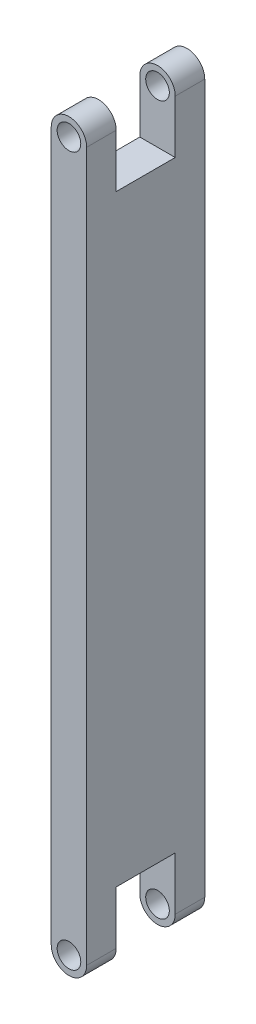
ISO-10303-21;
HEADER;
FILE_DESCRIPTION(('STEP AP214'),'2;1');
FILE_NAME('part.step','',(''),(''),'','','');
FILE_SCHEMA(('AUTOMOTIVE_DESIGN { 1 0 10303 214 1 1 1 1 }'));
ENDSEC;
DATA;
#1=APPLICATION_CONTEXT('core data for automotive mechanical design processes');
#2=APPLICATION_PROTOCOL_DEFINITION('international standard','automotive_design',2000,#1);
#3=PRODUCT_CONTEXT('',#1,'mechanical');
#4=PRODUCT('Part','Part','',(#3));
#5=PRODUCT_RELATED_PRODUCT_CATEGORY('part','',(#4));
#6=PRODUCT_DEFINITION_FORMATION('','',#4);
#7=PRODUCT_DEFINITION_CONTEXT('part definition',#1,'design');
#8=PRODUCT_DEFINITION('design','',#6,#7);
#9=PRODUCT_DEFINITION_SHAPE('','',#8);
#10=(LENGTH_UNIT() NAMED_UNIT(*) SI_UNIT(.MILLI.,.METRE.));
#11=(NAMED_UNIT(*) PLANE_ANGLE_UNIT() SI_UNIT($,.RADIAN.));
#12=(NAMED_UNIT(*) SI_UNIT($,.STERADIAN.) SOLID_ANGLE_UNIT());
#13=UNCERTAINTY_MEASURE_WITH_UNIT(LENGTH_MEASURE(1.E-05),#10,'distance_accuracy_value','');
#14=(GEOMETRIC_REPRESENTATION_CONTEXT(3) GLOBAL_UNCERTAINTY_ASSIGNED_CONTEXT((#13)) GLOBAL_UNIT_ASSIGNED_CONTEXT((#10,
#11,#12)) REPRESENTATION_CONTEXT('',''));
#15=CARTESIAN_POINT('',(0.,0.,0.));
#16=DIRECTION('',(0.,0.,1.));
#17=DIRECTION('',(1.,0.,0.));
#18=AXIS2_PLACEMENT_3D('',#15,#16,#17);
#19=CARTESIAN_POINT('',(0.,0.,50.));
#20=DIRECTION('',(0.,0.,-1.));
#21=DIRECTION('',(-1.,0.,0.));
#22=AXIS2_PLACEMENT_3D('',#19,#20,#21);
#23=CYLINDRICAL_SURFACE('',#22,7.5);
#24=DIRECTION('',(0.,0.,-1.));
#25=VECTOR('',#24,1.);
#26=CARTESIAN_POINT('',(7.5,0.,50.));
#27=LINE('',#26,#25);
#28=CARTESIAN_POINT('',(7.5,0.,12.5));
#29=VERTEX_POINT('',#28);
#30=CARTESIAN_POINT('',(7.5,0.,0.));
#31=VERTEX_POINT('',#30);
#32=EDGE_CURVE('E161',#29,#31,#27,.T.);
#33=ORIENTED_EDGE('',*,*,#32,.F.);
#34=CARTESIAN_POINT('',(0.,0.,12.5));
#35=DIRECTION('',(0.,0.,-1.));
#36=DIRECTION('',(0.,1.,0.));
#37=AXIS2_PLACEMENT_3D('',#34,#35,#36);
#38=CIRCLE('',#37,7.5);
#39=CARTESIAN_POINT('',(-7.5,0.,12.5));
#40=VERTEX_POINT('',#39);
#41=EDGE_CURVE('E199',#29,#40,#38,.T.);
#42=ORIENTED_EDGE('',*,*,#41,.T.);
#43=DIRECTION('',(0.,0.,-1.));
#44=VECTOR('',#43,1.);
#45=CARTESIAN_POINT('',(-7.5,0.,50.));
#46=LINE('',#45,#44);
#47=CARTESIAN_POINT('',(-7.5,0.,0.));
#48=VERTEX_POINT('',#47);
#49=EDGE_CURVE('E232',#40,#48,#46,.T.);
#50=ORIENTED_EDGE('',*,*,#49,.T.);
#51=CARTESIAN_POINT('',(0.,0.,0.));
#52=DIRECTION('',(0.,0.,1.));
#53=DIRECTION('',(1.,0.,0.));
#54=AXIS2_PLACEMENT_3D('',#51,#52,#53);
#55=CIRCLE('',#54,7.5);
#56=EDGE_CURVE('E222',#48,#31,#55,.T.);
#57=ORIENTED_EDGE('',*,*,#56,.T.);
#58=EDGE_LOOP('',(#33,#42,#50,#57));
#59=FACE_BOUND('',#58,.T.);
#60=ADVANCED_FACE('F34',(#59),#23,.T.);
#61=CARTESIAN_POINT('',(0.,300.,50.));
#62=DIRECTION('',(0.,0.,-1.));
#63=DIRECTION('',(-1.,0.,0.));
#64=AXIS2_PLACEMENT_3D('',#61,#62,#63);
#65=CYLINDRICAL_SURFACE('',#64,7.5);
#66=DIRECTION('',(0.,0.,-1.));
#67=VECTOR('',#66,1.);
#68=CARTESIAN_POINT('',(7.5,300.,50.));
#69=LINE('',#68,#67);
#70=CARTESIAN_POINT('',(7.5,300.,50.));
#71=VERTEX_POINT('',#70);
#72=CARTESIAN_POINT('',(7.5,300.,37.5));
#73=VERTEX_POINT('',#72);
#74=EDGE_CURVE('E154',#71,#73,#69,.T.);
#75=ORIENTED_EDGE('',*,*,#74,.T.);
#76=CARTESIAN_POINT('',(0.,300.,37.5));
#77=DIRECTION('',(0.,0.,1.));
#78=DIRECTION('',(1.,0.,0.));
#79=AXIS2_PLACEMENT_3D('',#76,#77,#78);
#80=CIRCLE('',#79,7.5);
#81=CARTESIAN_POINT('',(-7.5,300.,37.5));
#82=VERTEX_POINT('',#81);
#83=EDGE_CURVE('E220',#73,#82,#80,.T.);
#84=ORIENTED_EDGE('',*,*,#83,.T.);
#85=DIRECTION('',(0.,0.,-1.));
#86=VECTOR('',#85,1.);
#87=CARTESIAN_POINT('',(-7.5,300.,50.));
#88=LINE('',#87,#86);
#89=CARTESIAN_POINT('',(-7.5,300.,50.));
#90=VERTEX_POINT('',#89);
#91=EDGE_CURVE('E146',#90,#82,#88,.T.);
#92=ORIENTED_EDGE('',*,*,#91,.F.);
#93=CARTESIAN_POINT('',(0.,300.,50.));
#94=DIRECTION('',(0.,0.,1.));
#95=DIRECTION('',(1.,0.,0.));
#96=AXIS2_PLACEMENT_3D('',#93,#94,#95);
#97=CIRCLE('',#96,7.5);
#98=EDGE_CURVE('E229',#71,#90,#97,.T.);
#99=ORIENTED_EDGE('',*,*,#98,.F.);
#100=EDGE_LOOP('',(#75,#84,#92,#99));
#101=FACE_BOUND('',#100,.T.);
#102=ADVANCED_FACE('F266',(#101),#65,.T.);
#103=CARTESIAN_POINT('',(-7.5,0.,50.));
#104=VERTEX_POINT('',#103);
#105=CARTESIAN_POINT('',(-7.5,0.,37.5));
#106=VERTEX_POINT('',#105);
#107=EDGE_CURVE('E156',#104,#106,#46,.T.);
#108=ORIENTED_EDGE('',*,*,#107,.T.);
#109=CARTESIAN_POINT('',(0.,0.,37.5));
#110=DIRECTION('',(0.,0.,1.));
#111=DIRECTION('',(1.,0.,0.));
#112=AXIS2_PLACEMENT_3D('',#109,#110,#111);
#113=CIRCLE('',#112,7.5);
#114=CARTESIAN_POINT('',(7.5,0.,37.5));
#115=VERTEX_POINT('',#114);
#116=EDGE_CURVE('E216',#106,#115,#113,.T.);
#117=ORIENTED_EDGE('',*,*,#116,.T.);
#118=CARTESIAN_POINT('',(7.5,0.,50.));
#119=VERTEX_POINT('',#118);
#120=EDGE_CURVE('E162',#119,#115,#27,.T.);
#121=ORIENTED_EDGE('',*,*,#120,.F.);
#122=CARTESIAN_POINT('',(0.,0.,50.));
#123=DIRECTION('',(0.,0.,1.));
#124=DIRECTION('',(1.,0.,0.));
#125=AXIS2_PLACEMENT_3D('',#122,#123,#124);
#126=CIRCLE('',#125,7.5);
#127=EDGE_CURVE('E223',#104,#119,#126,.T.);
#128=ORIENTED_EDGE('',*,*,#127,.F.);
#129=EDGE_LOOP('',(#108,#117,#121,#128));
#130=FACE_BOUND('',#129,.T.);
#131=ADVANCED_FACE('F36',(#130),#23,.T.);
#132=CARTESIAN_POINT('',(7.5,0.,50.));
#133=DIRECTION('',(-1.,0.,0.));
#134=DIRECTION('',(0.,0.,1.));
#135=AXIS2_PLACEMENT_3D('',#132,#133,#134);
#136=PLANE('',#135);
#137=DIRECTION('',(0.,0.,-1.));
#138=VECTOR('',#137,1.);
#139=CARTESIAN_POINT('',(7.5,277.5,37.5));
#140=LINE('',#139,#138);
#141=CARTESIAN_POINT('',(7.5,277.5,37.5));
#142=VERTEX_POINT('',#141);
#143=CARTESIAN_POINT('',(7.5,277.5,12.5));
#144=VERTEX_POINT('',#143);
#145=EDGE_CURVE('E194',#142,#144,#140,.T.);
#146=ORIENTED_EDGE('',*,*,#145,.F.);
#147=DIRECTION('',(0.,-1.,0.));
#148=VECTOR('',#147,1.);
#149=CARTESIAN_POINT('',(7.5,307.5,37.5));
#150=LINE('',#149,#148);
#151=EDGE_CURVE('E131',#73,#142,#150,.T.);
#152=ORIENTED_EDGE('',*,*,#151,.F.);
#153=ORIENTED_EDGE('',*,*,#74,.F.);
#154=DIRECTION('',(0.,1.,0.));
#155=VECTOR('',#154,1.);
#156=CARTESIAN_POINT('',(7.5,0.,50.));
#157=LINE('',#156,#155);
#158=EDGE_CURVE('E226',#119,#71,#157,.T.);
#159=ORIENTED_EDGE('',*,*,#158,.F.);
#160=ORIENTED_EDGE('',*,*,#120,.T.);
#161=DIRECTION('',(0.,-1.,0.));
#162=VECTOR('',#161,1.);
#163=CARTESIAN_POINT('',(7.5,-7.5,37.5));
#164=LINE('',#163,#162);
#165=CARTESIAN_POINT('',(7.5,22.5,37.5));
#166=VERTEX_POINT('',#165);
#167=EDGE_CURVE('E190',#166,#115,#164,.T.);
#168=ORIENTED_EDGE('',*,*,#167,.F.);
#169=DIRECTION('',(0.,0.,1.));
#170=VECTOR('',#169,1.);
#171=CARTESIAN_POINT('',(7.5,22.5,37.5));
#172=LINE('',#171,#170);
#173=CARTESIAN_POINT('',(7.5,22.5,12.5));
#174=VERTEX_POINT('',#173);
#175=EDGE_CURVE('E204',#174,#166,#172,.T.);
#176=ORIENTED_EDGE('',*,*,#175,.F.);
#177=DIRECTION('',(0.,1.,0.));
#178=VECTOR('',#177,1.);
#179=CARTESIAN_POINT('',(7.5,-7.5,12.5));
#180=LINE('',#179,#178);
#181=EDGE_CURVE('E209',#29,#174,#180,.T.);
#182=ORIENTED_EDGE('',*,*,#181,.F.);
#183=ORIENTED_EDGE('',*,*,#32,.T.);
#184=DIRECTION('',(0.,1.,0.));
#185=VECTOR('',#184,1.);
#186=CARTESIAN_POINT('',(7.5,0.,0.));
#187=LINE('',#186,#185);
#188=CARTESIAN_POINT('',(7.5,300.,0.));
#189=VERTEX_POINT('',#188);
#190=EDGE_CURVE('E235',#31,#189,#187,.T.);
#191=ORIENTED_EDGE('',*,*,#190,.T.);
#192=CARTESIAN_POINT('',(7.5,300.,12.5));
#193=VERTEX_POINT('',#192);
#194=EDGE_CURVE('E151',#193,#189,#69,.T.);
#195=ORIENTED_EDGE('',*,*,#194,.F.);
#196=DIRECTION('',(0.,1.,0.));
#197=VECTOR('',#196,1.);
#198=CARTESIAN_POINT('',(7.5,307.5,12.5));
#199=LINE('',#198,#197);
#200=EDGE_CURVE('E141',#144,#193,#199,.T.);
#201=ORIENTED_EDGE('',*,*,#200,.F.);
#202=EDGE_LOOP('',(#146,#152,#153,#159,#160,#168,#176,#182,#183,#191,#195,#201));
#203=FACE_BOUND('',#202,.T.);
#204=ADVANCED_FACE('F262',(#203),#136,.F.);
#205=CARTESIAN_POINT('',(0.,300.,12.5));
#206=DIRECTION('',(0.,0.,-1.));
#207=DIRECTION('',(0.,1.,0.));
#208=AXIS2_PLACEMENT_3D('',#205,#206,#207);
#209=CIRCLE('',#208,7.5);
#210=CARTESIAN_POINT('',(-7.5,300.,12.5));
#211=VERTEX_POINT('',#210);
#212=EDGE_CURVE('E218',#211,#193,#209,.T.);
#213=ORIENTED_EDGE('',*,*,#212,.T.);
#214=ORIENTED_EDGE('',*,*,#194,.T.);
#215=CARTESIAN_POINT('',(0.,300.,0.));
#216=DIRECTION('',(0.,0.,1.));
#217=DIRECTION('',(1.,0.,0.));
#218=AXIS2_PLACEMENT_3D('',#215,#216,#217);
#219=CIRCLE('',#218,7.5);
#220=CARTESIAN_POINT('',(-7.5,300.,0.));
#221=VERTEX_POINT('',#220);
#222=EDGE_CURVE('E238',#189,#221,#219,.T.);
#223=ORIENTED_EDGE('',*,*,#222,.T.);
#224=EDGE_CURVE('E152',#211,#221,#88,.T.);
#225=ORIENTED_EDGE('',*,*,#224,.F.);
#226=EDGE_LOOP('',(#213,#214,#223,#225));
#227=FACE_BOUND('',#226,.T.);
#228=ADVANCED_FACE('F271',(#227),#65,.T.);
#229=CARTESIAN_POINT('',(-7.5,0.,50.));
#230=DIRECTION('',(1.,0.,0.));
#231=DIRECTION('',(0.,0.,-1.));
#232=AXIS2_PLACEMENT_3D('',#229,#230,#231);
#233=PLANE('',#232);
#234=ORIENTED_EDGE('',*,*,#91,.T.);
#235=DIRECTION('',(0.,-1.,0.));
#236=VECTOR('',#235,1.);
#237=CARTESIAN_POINT('',(-7.5,0.,37.5));
#238=LINE('',#237,#236);
#239=CARTESIAN_POINT('',(-7.5,277.5,37.5));
#240=VERTEX_POINT('',#239);
#241=EDGE_CURVE('E11',#82,#240,#238,.T.);
#242=ORIENTED_EDGE('',*,*,#241,.T.);
#243=DIRECTION('',(0.,0.,-1.));
#244=VECTOR('',#243,1.);
#245=CARTESIAN_POINT('',(-7.5,277.5,37.5));
#246=LINE('',#245,#244);
#247=CARTESIAN_POINT('',(-7.5,277.5,12.5));
#248=VERTEX_POINT('',#247);
#249=EDGE_CURVE('E138',#240,#248,#246,.T.);
#250=ORIENTED_EDGE('',*,*,#249,.T.);
#251=DIRECTION('',(0.,1.,0.));
#252=VECTOR('',#251,1.);
#253=CARTESIAN_POINT('',(-7.5,307.5,12.5));
#254=LINE('',#253,#252);
#255=EDGE_CURVE('E51',#248,#211,#254,.T.);
#256=ORIENTED_EDGE('',*,*,#255,.T.);
#257=ORIENTED_EDGE('',*,*,#224,.T.);
#258=DIRECTION('',(0.,-1.,0.));
#259=VECTOR('',#258,1.);
#260=CARTESIAN_POINT('',(-7.5,0.,0.));
#261=LINE('',#260,#259);
#262=EDGE_CURVE('E227',#221,#48,#261,.T.);
#263=ORIENTED_EDGE('',*,*,#262,.T.);
#264=ORIENTED_EDGE('',*,*,#49,.F.);
#265=DIRECTION('',(0.,1.,0.));
#266=VECTOR('',#265,1.);
#267=CARTESIAN_POINT('',(-7.5,0.,12.5));
#268=LINE('',#267,#266);
#269=CARTESIAN_POINT('',(-7.5,22.5,12.5));
#270=VERTEX_POINT('',#269);
#271=EDGE_CURVE('E43',#40,#270,#268,.T.);
#272=ORIENTED_EDGE('',*,*,#271,.T.);
#273=DIRECTION('',(0.,0.,1.));
#274=VECTOR('',#273,1.);
#275=CARTESIAN_POINT('',(-7.5,22.5,37.5));
#276=LINE('',#275,#274);
#277=CARTESIAN_POINT('',(-7.5,22.5,37.5));
#278=VERTEX_POINT('',#277);
#279=EDGE_CURVE('E59',#270,#278,#276,.T.);
#280=ORIENTED_EDGE('',*,*,#279,.T.);
#281=DIRECTION('',(0.,-1.,0.));
#282=VECTOR('',#281,1.);
#283=CARTESIAN_POINT('',(-7.5,-7.5,37.5));
#284=LINE('',#283,#282);
#285=EDGE_CURVE('E201',#278,#106,#284,.T.);
#286=ORIENTED_EDGE('',*,*,#285,.T.);
#287=ORIENTED_EDGE('',*,*,#107,.F.);
#288=DIRECTION('',(0.,-1.,0.));
#289=VECTOR('',#288,1.);
#290=CARTESIAN_POINT('',(-7.5,0.,50.));
#291=LINE('',#290,#289);
#292=EDGE_CURVE('E148',#90,#104,#291,.T.);
#293=ORIENTED_EDGE('',*,*,#292,.F.);
#294=EDGE_LOOP('',(#234,#242,#250,#256,#257,#263,#264,#272,#280,#286,#287,#293));
#295=FACE_BOUND('',#294,.T.);
#296=ADVANCED_FACE('F143',(#295),#233,.F.);
#297=CARTESIAN_POINT('',(0.,0.,50.));
#298=DIRECTION('',(0.,0.,1.));
#299=DIRECTION('',(1.,0.,0.));
#300=AXIS2_PLACEMENT_3D('',#297,#298,#299);
#301=PLANE('',#300);
#302=CARTESIAN_POINT('',(0.,300.,50.));
#303=DIRECTION('',(0.,0.,1.));
#304=DIRECTION('',(1.,0.,0.));
#305=AXIS2_PLACEMENT_3D('',#302,#303,#304);
#306=CIRCLE('',#305,5.);
#307=CARTESIAN_POINT('',(5.,300.,50.));
#308=VERTEX_POINT('',#307);
#309=EDGE_CURVE('E175',#308,#308,#306,.T.);
#310=ORIENTED_EDGE('',*,*,#309,.F.);
#311=EDGE_LOOP('',(#310));
#312=FACE_BOUND('',#311,.T.);
#313=CARTESIAN_POINT('',(0.,0.,50.));
#314=DIRECTION('',(0.,0.,1.));
#315=DIRECTION('',(1.,0.,0.));
#316=AXIS2_PLACEMENT_3D('',#313,#314,#315);
#317=CIRCLE('',#316,5.);
#318=CARTESIAN_POINT('',(5.,0.,50.));
#319=VERTEX_POINT('',#318);
#320=EDGE_CURVE('E185',#319,#319,#317,.T.);
#321=ORIENTED_EDGE('',*,*,#320,.F.);
#322=EDGE_LOOP('',(#321));
#323=FACE_BOUND('',#322,.T.);
#324=ORIENTED_EDGE('',*,*,#127,.T.);
#325=ORIENTED_EDGE('',*,*,#158,.T.);
#326=ORIENTED_EDGE('',*,*,#98,.T.);
#327=ORIENTED_EDGE('',*,*,#292,.T.);
#328=EDGE_LOOP('',(#324,#325,#326,#327));
#329=FACE_BOUND('',#328,.T.);
#330=ADVANCED_FACE('F265',(#312,#323,#329),#301,.T.);
#331=CARTESIAN_POINT('',(0.,0.,0.));
#332=DIRECTION('',(0.,0.,1.));
#333=DIRECTION('',(1.,0.,0.));
#334=AXIS2_PLACEMENT_3D('',#331,#332,#333);
#335=PLANE('',#334);
#336=CARTESIAN_POINT('',(0.,300.,0.));
#337=DIRECTION('',(0.,0.,1.));
#338=DIRECTION('',(1.,0.,0.));
#339=AXIS2_PLACEMENT_3D('',#336,#337,#338);
#340=CIRCLE('',#339,5.);
#341=CARTESIAN_POINT('',(5.,300.,0.));
#342=VERTEX_POINT('',#341);
#343=EDGE_CURVE('E169',#342,#342,#340,.T.);
#344=ORIENTED_EDGE('',*,*,#343,.T.);
#345=EDGE_LOOP('',(#344));
#346=FACE_BOUND('',#345,.T.);
#347=CARTESIAN_POINT('',(0.,0.,0.));
#348=DIRECTION('',(0.,0.,1.));
#349=DIRECTION('',(1.,0.,0.));
#350=AXIS2_PLACEMENT_3D('',#347,#348,#349);
#351=CIRCLE('',#350,5.);
#352=CARTESIAN_POINT('',(5.,0.,0.));
#353=VERTEX_POINT('',#352);
#354=EDGE_CURVE('E180',#353,#353,#351,.T.);
#355=ORIENTED_EDGE('',*,*,#354,.T.);
#356=EDGE_LOOP('',(#355));
#357=FACE_BOUND('',#356,.T.);
#358=ORIENTED_EDGE('',*,*,#56,.F.);
#359=ORIENTED_EDGE('',*,*,#262,.F.);
#360=ORIENTED_EDGE('',*,*,#222,.F.);
#361=ORIENTED_EDGE('',*,*,#190,.F.);
#362=EDGE_LOOP('',(#358,#359,#360,#361));
#363=FACE_BOUND('',#362,.T.);
#364=ADVANCED_FACE('F248',(#346,#357,#363),#335,.F.);
#365=CARTESIAN_POINT('',(-7.5,-7.5,37.5));
#366=DIRECTION('',(0.,0.,1.));
#367=DIRECTION('',(1.,0.,0.));
#368=AXIS2_PLACEMENT_3D('',#365,#366,#367);
#369=PLANE('',#368);
#370=CARTESIAN_POINT('',(0.,0.,37.5));
#371=DIRECTION('',(0.,0.,1.));
#372=DIRECTION('',(1.,0.,0.));
#373=AXIS2_PLACEMENT_3D('',#370,#371,#372);
#374=CIRCLE('',#373,5.);
#375=CARTESIAN_POINT('',(5.,0.,37.5));
#376=VERTEX_POINT('',#375);
#377=EDGE_CURVE('E188',#376,#376,#374,.T.);
#378=ORIENTED_EDGE('',*,*,#377,.T.);
#379=EDGE_LOOP('',(#378));
#380=FACE_BOUND('',#379,.T.);
#381=ORIENTED_EDGE('',*,*,#285,.F.);
#382=DIRECTION('',(1.,0.,0.));
#383=VECTOR('',#382,1.);
#384=CARTESIAN_POINT('',(-7.5,22.5,37.5));
#385=LINE('',#384,#383);
#386=EDGE_CURVE('E195',#278,#166,#385,.T.);
#387=ORIENTED_EDGE('',*,*,#386,.T.);
#388=ORIENTED_EDGE('',*,*,#167,.T.);
#389=ORIENTED_EDGE('',*,*,#116,.F.);
#390=EDGE_LOOP('',(#381,#387,#388,#389));
#391=FACE_BOUND('',#390,.T.);
#392=ADVANCED_FACE('F258',(#380,#391),#369,.F.);
#393=CARTESIAN_POINT('',(-7.5,-7.5,12.5));
#394=DIRECTION('',(0.,0.,-1.));
#395=DIRECTION('',(0.,1.,0.));
#396=AXIS2_PLACEMENT_3D('',#393,#394,#395);
#397=PLANE('',#396);
#398=CARTESIAN_POINT('',(0.,0.,12.5));
#399=DIRECTION('',(0.,0.,-1.));
#400=DIRECTION('',(0.,1.,0.));
#401=AXIS2_PLACEMENT_3D('',#398,#399,#400);
#402=CIRCLE('',#401,5.);
#403=CARTESIAN_POINT('',(0.,5.,12.5));
#404=VERTEX_POINT('',#403);
#405=EDGE_CURVE('E38',#404,#404,#402,.T.);
#406=ORIENTED_EDGE('',*,*,#405,.T.);
#407=EDGE_LOOP('',(#406));
#408=FACE_BOUND('',#407,.T.);
#409=ORIENTED_EDGE('',*,*,#181,.T.);
#410=DIRECTION('',(1.,0.,0.));
#411=VECTOR('',#410,1.);
#412=CARTESIAN_POINT('',(-7.5,22.5,12.5));
#413=LINE('',#412,#411);
#414=EDGE_CURVE('E206',#270,#174,#413,.T.);
#415=ORIENTED_EDGE('',*,*,#414,.F.);
#416=ORIENTED_EDGE('',*,*,#271,.F.);
#417=ORIENTED_EDGE('',*,*,#41,.F.);
#418=EDGE_LOOP('',(#409,#415,#416,#417));
#419=FACE_BOUND('',#418,.T.);
#420=ADVANCED_FACE('F274',(#408,#419),#397,.F.);
#421=CARTESIAN_POINT('',(-7.5,22.5,37.5));
#422=DIRECTION('',(0.,1.,0.));
#423=DIRECTION('',(0.,0.,1.));
#424=AXIS2_PLACEMENT_3D('',#421,#422,#423);
#425=PLANE('',#424);
#426=ORIENTED_EDGE('',*,*,#175,.T.);
#427=ORIENTED_EDGE('',*,*,#386,.F.);
#428=ORIENTED_EDGE('',*,*,#279,.F.);
#429=ORIENTED_EDGE('',*,*,#414,.T.);
#430=EDGE_LOOP('',(#426,#427,#428,#429));
#431=FACE_BOUND('',#430,.T.);
#432=ADVANCED_FACE('F275',(#431),#425,.F.);
#433=CARTESIAN_POINT('',(-7.5,307.5,37.5));
#434=DIRECTION('',(0.,0.,1.));
#435=DIRECTION('',(1.,0.,0.));
#436=AXIS2_PLACEMENT_3D('',#433,#434,#435);
#437=PLANE('',#436);
#438=CARTESIAN_POINT('',(0.,300.,37.5));
#439=DIRECTION('',(0.,0.,1.));
#440=DIRECTION('',(1.,0.,0.));
#441=AXIS2_PLACEMENT_3D('',#438,#439,#440);
#442=CIRCLE('',#441,5.);
#443=CARTESIAN_POINT('',(5.,300.,37.5));
#444=VERTEX_POINT('',#443);
#445=EDGE_CURVE('E168',#444,#444,#442,.T.);
#446=ORIENTED_EDGE('',*,*,#445,.T.);
#447=EDGE_LOOP('',(#446));
#448=FACE_BOUND('',#447,.T.);
#449=ORIENTED_EDGE('',*,*,#151,.T.);
#450=DIRECTION('',(1.,0.,0.));
#451=VECTOR('',#450,1.);
#452=CARTESIAN_POINT('',(-7.5,277.5,37.5));
#453=LINE('',#452,#451);
#454=EDGE_CURVE('E126',#240,#142,#453,.T.);
#455=ORIENTED_EDGE('',*,*,#454,.F.);
#456=ORIENTED_EDGE('',*,*,#241,.F.);
#457=ORIENTED_EDGE('',*,*,#83,.F.);
#458=EDGE_LOOP('',(#449,#455,#456,#457));
#459=FACE_BOUND('',#458,.T.);
#460=ADVANCED_FACE('F128',(#448,#459),#437,.F.);
#461=CARTESIAN_POINT('',(-7.5,307.5,12.5));
#462=DIRECTION('',(0.,0.,-1.));
#463=DIRECTION('',(0.,1.,0.));
#464=AXIS2_PLACEMENT_3D('',#461,#462,#463);
#465=PLANE('',#464);
#466=CARTESIAN_POINT('',(0.,300.,12.5));
#467=DIRECTION('',(0.,0.,-1.));
#468=DIRECTION('',(0.,1.,0.));
#469=AXIS2_PLACEMENT_3D('',#466,#467,#468);
#470=CIRCLE('',#469,5.);
#471=CARTESIAN_POINT('',(0.,305.,12.5));
#472=VERTEX_POINT('',#471);
#473=EDGE_CURVE('E166',#472,#472,#470,.T.);
#474=ORIENTED_EDGE('',*,*,#473,.T.);
#475=EDGE_LOOP('',(#474));
#476=FACE_BOUND('',#475,.T.);
#477=ORIENTED_EDGE('',*,*,#212,.F.);
#478=ORIENTED_EDGE('',*,*,#255,.F.);
#479=DIRECTION('',(1.,0.,0.));
#480=VECTOR('',#479,1.);
#481=CARTESIAN_POINT('',(-7.5,277.5,12.5));
#482=LINE('',#481,#480);
#483=EDGE_CURVE('E135',#248,#144,#482,.T.);
#484=ORIENTED_EDGE('',*,*,#483,.T.);
#485=ORIENTED_EDGE('',*,*,#200,.T.);
#486=EDGE_LOOP('',(#477,#478,#484,#485));
#487=FACE_BOUND('',#486,.T.);
#488=ADVANCED_FACE('F269',(#476,#487),#465,.F.);
#489=CARTESIAN_POINT('',(-7.5,277.5,37.5));
#490=DIRECTION('',(0.,-1.,0.));
#491=DIRECTION('',(0.,0.,-1.));
#492=AXIS2_PLACEMENT_3D('',#489,#490,#491);
#493=PLANE('',#492);
#494=ORIENTED_EDGE('',*,*,#145,.T.);
#495=ORIENTED_EDGE('',*,*,#483,.F.);
#496=ORIENTED_EDGE('',*,*,#249,.F.);
#497=ORIENTED_EDGE('',*,*,#454,.T.);
#498=EDGE_LOOP('',(#494,#495,#496,#497));
#499=FACE_BOUND('',#498,.T.);
#500=ADVANCED_FACE('F139',(#499),#493,.F.);
#501=CARTESIAN_POINT('',(0.,300.,0.));
#502=DIRECTION('',(0.,0.,1.));
#503=DIRECTION('',(1.,0.,0.));
#504=AXIS2_PLACEMENT_3D('',#501,#502,#503);
#505=CYLINDRICAL_SURFACE('',#504,5.);
#506=ORIENTED_EDGE('',*,*,#343,.F.);
#507=EDGE_LOOP('',(#506));
#508=FACE_BOUND('',#507,.T.);
#509=ORIENTED_EDGE('',*,*,#473,.F.);
#510=EDGE_LOOP('',(#509));
#511=FACE_BOUND('',#510,.T.);
#512=ADVANCED_FACE('F327',(#508,#511),#505,.F.);
#513=ORIENTED_EDGE('',*,*,#309,.T.);
#514=EDGE_LOOP('',(#513));
#515=FACE_BOUND('',#514,.T.);
#516=ORIENTED_EDGE('',*,*,#445,.F.);
#517=EDGE_LOOP('',(#516));
#518=FACE_BOUND('',#517,.T.);
#519=ADVANCED_FACE('F320',(#515,#518),#505,.F.);
#520=CARTESIAN_POINT('',(0.,0.,0.));
#521=DIRECTION('',(0.,0.,1.));
#522=DIRECTION('',(1.,0.,0.));
#523=AXIS2_PLACEMENT_3D('',#520,#521,#522);
#524=CYLINDRICAL_SURFACE('',#523,5.);
#525=ORIENTED_EDGE('',*,*,#354,.F.);
#526=EDGE_LOOP('',(#525));
#527=FACE_BOUND('',#526,.T.);
#528=ORIENTED_EDGE('',*,*,#405,.F.);
#529=EDGE_LOOP('',(#528));
#530=FACE_BOUND('',#529,.T.);
#531=ADVANCED_FACE('F314',(#527,#530),#524,.F.);
#532=ORIENTED_EDGE('',*,*,#320,.T.);
#533=EDGE_LOOP('',(#532));
#534=FACE_BOUND('',#533,.T.);
#535=ORIENTED_EDGE('',*,*,#377,.F.);
#536=EDGE_LOOP('',(#535));
#537=FACE_BOUND('',#536,.T.);
#538=ADVANCED_FACE('F312',(#534,#537),#524,.F.);
#539=CLOSED_SHELL('',(#60,#102,#131,#204,#228,#296,#330,#364,#392,#420,#432,#460,#488,#500,#512,
#519,#531,#538));
#540=MANIFOLD_SOLID_BREP('B2',#539);
#541=ADVANCED_BREP_SHAPE_REPRESENTATION('',(#18,#540),#14);
#542=SHAPE_DEFINITION_REPRESENTATION(#9,#541);
ENDSEC;
END-ISO-10303-21;
